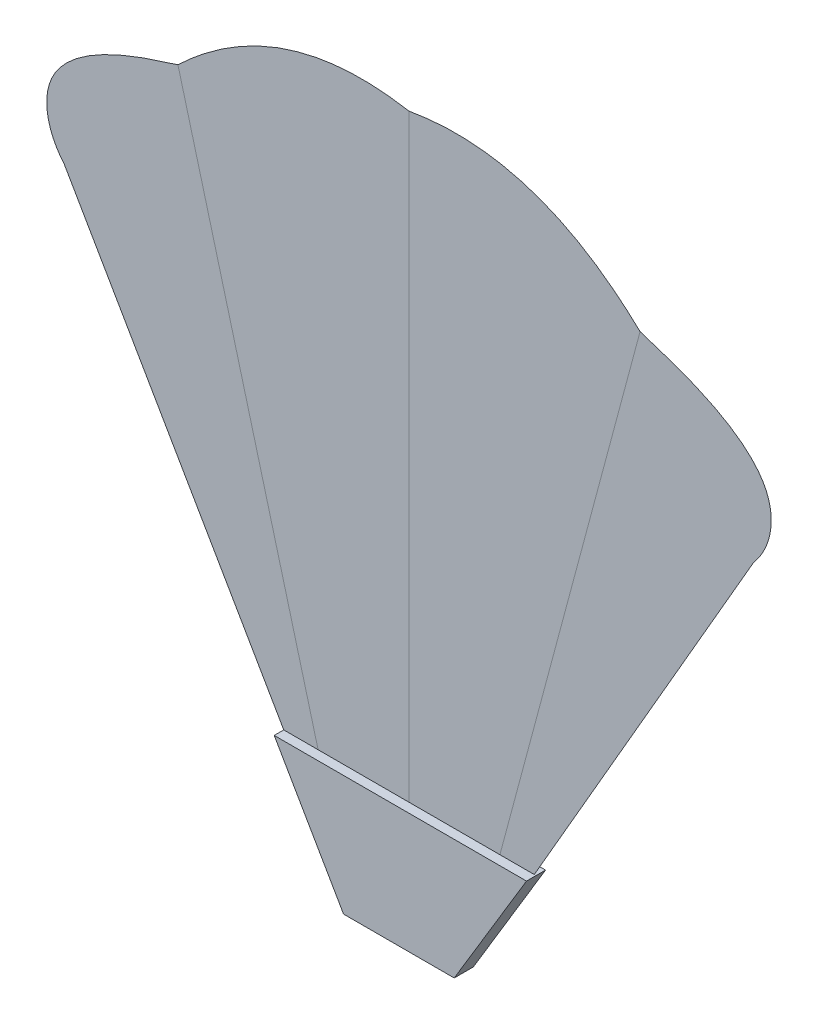
ISO-10303-21;
HEADER;
FILE_DESCRIPTION(('STEP AP214'),'2;1');
FILE_NAME('part.step','',(''),(''),'','','');
FILE_SCHEMA(('AUTOMOTIVE_DESIGN { 1 0 10303 214 1 1 1 1 }'));
ENDSEC;
DATA;
#1=APPLICATION_CONTEXT('core data for automotive mechanical design processes');
#2=APPLICATION_PROTOCOL_DEFINITION('international standard','automotive_design',2000,#1);
#3=PRODUCT_CONTEXT('',#1,'mechanical');
#4=PRODUCT('Part','Part','',(#3));
#5=PRODUCT_RELATED_PRODUCT_CATEGORY('part','',(#4));
#6=PRODUCT_DEFINITION_FORMATION('','',#4);
#7=PRODUCT_DEFINITION_CONTEXT('part definition',#1,'design');
#8=PRODUCT_DEFINITION('design','',#6,#7);
#9=PRODUCT_DEFINITION_SHAPE('','',#8);
#10=(LENGTH_UNIT() NAMED_UNIT(*) SI_UNIT(.MILLI.,.METRE.));
#11=(NAMED_UNIT(*) PLANE_ANGLE_UNIT() SI_UNIT($,.RADIAN.));
#12=(NAMED_UNIT(*) SI_UNIT($,.STERADIAN.) SOLID_ANGLE_UNIT());
#13=UNCERTAINTY_MEASURE_WITH_UNIT(LENGTH_MEASURE(1.E-05),#10,'distance_accuracy_value','');
#14=(GEOMETRIC_REPRESENTATION_CONTEXT(3) GLOBAL_UNCERTAINTY_ASSIGNED_CONTEXT((#13)) GLOBAL_UNIT_ASSIGNED_CONTEXT((#10,
#11,#12)) REPRESENTATION_CONTEXT('',''));
#15=CARTESIAN_POINT('',(0.,0.,0.));
#16=DIRECTION('',(0.,0.,1.));
#17=DIRECTION('',(1.,0.,0.));
#18=AXIS2_PLACEMENT_3D('',#15,#16,#17);
#19=CARTESIAN_POINT('',(-52.5710317573309,-370.671309457904,4.));
#20=DIRECTION('',(0.866025403784439,0.5,0.));
#21=DIRECTION('',(-0.5,0.866025403784439,0.));
#22=AXIS2_PLACEMENT_3D('',#19,#20,#21);
#23=PLANE('',#22);
#24=DIRECTION('',(0.5,-0.866025403784439,0.));
#25=VECTOR('',#24,1.);
#26=CARTESIAN_POINT('',(-52.5710317573309,-370.671309457904,-4.));
#27=LINE('',#26,#25);
#28=CARTESIAN_POINT('',(-52.5710317573309,-370.671309457904,-4.));
#29=VERTEX_POINT('',#28);
#30=CARTESIAN_POINT('',(-23.4712554232924,-421.073600557349,-4.));
#31=VERTEX_POINT('',#30);
#32=EDGE_CURVE('E154',#29,#31,#27,.T.);
#33=ORIENTED_EDGE('',*,*,#32,.T.);
#34=DIRECTION('',(0.,0.,-1.));
#35=VECTOR('',#34,1.);
#36=CARTESIAN_POINT('',(-23.4712554232924,-421.073600557349,4.));
#37=LINE('',#36,#35);
#38=CARTESIAN_POINT('',(-23.4712554232924,-421.073600557349,4.));
#39=VERTEX_POINT('',#38);
#40=EDGE_CURVE('E14',#39,#31,#37,.T.);
#41=ORIENTED_EDGE('',*,*,#40,.F.);
#42=DIRECTION('',(0.5,-0.866025403784439,0.));
#43=VECTOR('',#42,1.);
#44=CARTESIAN_POINT('',(-52.5710317573309,-370.671309457904,4.));
#45=LINE('',#44,#43);
#46=CARTESIAN_POINT('',(-52.5710317573309,-370.671309457904,4.));
#47=VERTEX_POINT('',#46);
#48=EDGE_CURVE('E142',#47,#39,#45,.T.);
#49=ORIENTED_EDGE('',*,*,#48,.F.);
#50=DIRECTION('',(0.,0.,-1.));
#51=VECTOR('',#50,1.);
#52=CARTESIAN_POINT('',(-52.5710317573309,-370.671309457904,4.));
#53=LINE('',#52,#51);
#54=EDGE_CURVE('E150',#47,#29,#53,.T.);
#55=ORIENTED_EDGE('',*,*,#54,.T.);
#56=EDGE_LOOP('',(#33,#41,#49,#55));
#57=FACE_BOUND('',#56,.T.);
#58=ADVANCED_FACE('F91',(#57),#23,.F.);
#59=CARTESIAN_POINT('',(-23.4712554232924,-421.073600557349,4.));
#60=DIRECTION('',(0.,1.,0.));
#61=DIRECTION('',(0.,0.,1.));
#62=AXIS2_PLACEMENT_3D('',#59,#60,#61);
#63=PLANE('',#62);
#64=CARTESIAN_POINT('',(0.,-421.073600557349,0.));
#65=DIRECTION('',(0.,-1.,0.));
#66=DIRECTION('',(0.,0.,-1.));
#67=AXIS2_PLACEMENT_3D('',#64,#65,#66);
#68=CIRCLE('',#67,1.75);
#69=CARTESIAN_POINT('',(0.,-421.073600557349,-1.75));
#70=VERTEX_POINT('',#69);
#71=EDGE_CURVE('E168',#70,#70,#68,.T.);
#72=ORIENTED_EDGE('',*,*,#71,.F.);
#73=EDGE_LOOP('',(#72));
#74=FACE_BOUND('',#73,.T.);
#75=DIRECTION('',(1.,0.,0.));
#76=VECTOR('',#75,1.);
#77=CARTESIAN_POINT('',(-23.4712554232924,-421.073600557349,-4.));
#78=LINE('',#77,#76);
#79=CARTESIAN_POINT('',(22.9815003626385,-421.073600557349,-4.));
#80=VERTEX_POINT('',#79);
#81=EDGE_CURVE('E146',#31,#80,#78,.T.);
#82=ORIENTED_EDGE('',*,*,#81,.T.);
#83=DIRECTION('',(0.,0.,-1.));
#84=VECTOR('',#83,1.);
#85=CARTESIAN_POINT('',(22.9815003626385,-421.073600557349,4.));
#86=LINE('',#85,#84);
#87=CARTESIAN_POINT('',(22.9815003626385,-421.073600557349,4.));
#88=VERTEX_POINT('',#87);
#89=EDGE_CURVE('E99',#88,#80,#86,.T.);
#90=ORIENTED_EDGE('',*,*,#89,.F.);
#91=DIRECTION('',(1.,0.,0.));
#92=VECTOR('',#91,1.);
#93=CARTESIAN_POINT('',(-23.4712554232924,-421.073600557349,4.));
#94=LINE('',#93,#92);
#95=EDGE_CURVE('E137',#39,#88,#94,.T.);
#96=ORIENTED_EDGE('',*,*,#95,.F.);
#97=ORIENTED_EDGE('',*,*,#40,.T.);
#98=EDGE_LOOP('',(#82,#90,#96,#97));
#99=FACE_BOUND('',#98,.T.);
#100=ADVANCED_FACE('F145',(#74,#99),#63,.F.);
#101=CARTESIAN_POINT('',(22.9815003626385,-421.073600557349,4.));
#102=DIRECTION('',(-0.856782690973709,0.515677632293519,0.));
#103=DIRECTION('',(-0.515677632293519,-0.856782690973709,0.));
#104=AXIS2_PLACEMENT_3D('',#101,#102,#103);
#105=PLANE('',#104);
#106=DIRECTION('',(0.515677632293519,0.856782690973709,0.));
#107=VECTOR('',#106,1.);
#108=CARTESIAN_POINT('',(22.9815003626385,-421.073600557349,-4.));
#109=LINE('',#108,#107);
#110=CARTESIAN_POINT('',(53.3174705102055,-370.671309457904,-4.));
#111=VERTEX_POINT('',#110);
#112=EDGE_CURVE('E124',#80,#111,#109,.T.);
#113=ORIENTED_EDGE('',*,*,#112,.T.);
#114=DIRECTION('',(0.,0.,-1.));
#115=VECTOR('',#114,1.);
#116=CARTESIAN_POINT('',(53.3174705102055,-370.671309457904,4.));
#117=LINE('',#116,#115);
#118=CARTESIAN_POINT('',(53.3174705102055,-370.671309457904,4.));
#119=VERTEX_POINT('',#118);
#120=EDGE_CURVE('E147',#119,#111,#117,.T.);
#121=ORIENTED_EDGE('',*,*,#120,.F.);
#122=DIRECTION('',(0.515677632293519,0.856782690973709,0.));
#123=VECTOR('',#122,1.);
#124=CARTESIAN_POINT('',(22.9815003626385,-421.073600557349,4.));
#125=LINE('',#124,#123);
#126=EDGE_CURVE('E140',#88,#119,#125,.T.);
#127=ORIENTED_EDGE('',*,*,#126,.F.);
#128=ORIENTED_EDGE('',*,*,#89,.T.);
#129=EDGE_LOOP('',(#113,#121,#127,#128));
#130=FACE_BOUND('',#129,.T.);
#131=ADVANCED_FACE('F148',(#130),#105,.F.);
#132=CARTESIAN_POINT('',(-52.5710317573309,-370.671309457904,4.));
#133=DIRECTION('',(0.,-1.,0.));
#134=DIRECTION('',(0.,0.,-1.));
#135=AXIS2_PLACEMENT_3D('',#132,#133,#134);
#136=PLANE('',#135);
#137=DIRECTION('',(-1.,0.,0.));
#138=VECTOR('',#137,1.);
#139=CARTESIAN_POINT('',(-52.5710317573309,-370.671309457904,-4.));
#140=LINE('',#139,#138);
#141=EDGE_CURVE('E130',#111,#29,#140,.T.);
#142=ORIENTED_EDGE('',*,*,#141,.T.);
#143=ORIENTED_EDGE('',*,*,#54,.F.);
#144=DIRECTION('',(-1.,0.,0.));
#145=VECTOR('',#144,1.);
#146=CARTESIAN_POINT('',(-52.5710317573309,-370.671309457904,4.));
#147=LINE('',#146,#145);
#148=EDGE_CURVE('E107',#119,#47,#147,.T.);
#149=ORIENTED_EDGE('',*,*,#148,.F.);
#150=ORIENTED_EDGE('',*,*,#120,.T.);
#151=EDGE_LOOP('',(#142,#143,#149,#150));
#152=FACE_BOUND('',#151,.T.);
#153=ADVANCED_FACE('F162',(#152),#136,.F.);
#154=CARTESIAN_POINT('',(0.,0.,4.));
#155=DIRECTION('',(0.,0.,1.));
#156=DIRECTION('',(1.,0.,0.));
#157=AXIS2_PLACEMENT_3D('',#154,#155,#156);
#158=PLANE('',#157);
#159=ORIENTED_EDGE('',*,*,#48,.T.);
#160=ORIENTED_EDGE('',*,*,#95,.T.);
#161=ORIENTED_EDGE('',*,*,#126,.T.);
#162=ORIENTED_EDGE('',*,*,#148,.T.);
#163=EDGE_LOOP('',(#159,#160,#161,#162));
#164=FACE_BOUND('',#163,.T.);
#165=ADVANCED_FACE('F138',(#164),#158,.T.);
#166=CARTESIAN_POINT('',(0.,0.,-4.));
#167=DIRECTION('',(0.,0.,1.));
#168=DIRECTION('',(1.,0.,0.));
#169=AXIS2_PLACEMENT_3D('',#166,#167,#168);
#170=PLANE('',#169);
#171=ORIENTED_EDGE('',*,*,#32,.F.);
#172=ORIENTED_EDGE('',*,*,#141,.F.);
#173=ORIENTED_EDGE('',*,*,#112,.F.);
#174=ORIENTED_EDGE('',*,*,#81,.F.);
#175=EDGE_LOOP('',(#171,#172,#173,#174));
#176=FACE_BOUND('',#175,.T.);
#177=ADVANCED_FACE('F165',(#176),#170,.F.);
#178=CARTESIAN_POINT('',(0.,-416.073600557349,0.));
#179=DIRECTION('',(0.,-1.,0.));
#180=DIRECTION('',(0.,0.,-1.));
#181=AXIS2_PLACEMENT_3D('',#178,#179,#180);
#182=CYLINDRICAL_SURFACE('',#181,1.75);
#183=CARTESIAN_POINT('',(0.,-416.073600557349,0.));
#184=DIRECTION('',(0.,-1.,0.));
#185=DIRECTION('',(0.,0.,-1.));
#186=AXIS2_PLACEMENT_3D('',#183,#184,#185);
#187=CIRCLE('',#186,1.75);
#188=CARTESIAN_POINT('',(0.,-416.073600557349,-1.75));
#189=VERTEX_POINT('',#188);
#190=EDGE_CURVE('E157',#189,#189,#187,.T.);
#191=ORIENTED_EDGE('',*,*,#190,.F.);
#192=EDGE_LOOP('',(#191));
#193=FACE_BOUND('',#192,.T.);
#194=ORIENTED_EDGE('',*,*,#71,.T.);
#195=EDGE_LOOP('',(#194));
#196=FACE_BOUND('',#195,.T.);
#197=ADVANCED_FACE('F176',(#193,#196),#182,.F.);
#198=CARTESIAN_POINT('',(0.,-416.073600557349,0.));
#199=DIRECTION('',(0.,-1.,0.));
#200=DIRECTION('',(0.,0.,-1.));
#201=AXIS2_PLACEMENT_3D('',#198,#199,#200);
#202=PLANE('',#201);
#203=ORIENTED_EDGE('',*,*,#190,.T.);
#204=EDGE_LOOP('',(#203));
#205=FACE_BOUND('',#204,.T.);
#206=ADVANCED_FACE('F174',(#205),#202,.T.);
#207=CLOSED_SHELL('',(#58,#100,#131,#153,#165,#177,#197,#206));
#208=MANIFOLD_SOLID_BREP('B2',#207);
#209=CARTESIAN_POINT('',(0.,0.,0.));
#210=DIRECTION('',(0.,0.,1.));
#211=DIRECTION('',(-1.,0.,0.));
#212=AXIS2_PLACEMENT_3D('',#209,#210,#211);
#213=PLANE('',#212);
#214=CARTESIAN_POINT('',(0.,-119.453282977764,0.));
#215=CARTESIAN_POINT('',(53.8199687706438,-109.90409605022,0.));
#216=CARTESIAN_POINT('',(96.9872981077789,-151.105229203007,0.));
#217=B_SPLINE_CURVE_WITH_KNOTS('',2,(#214,#215,#216),.UNSPECIFIED.,.F.,.F.,(3,3),(0.,1.),.UNSPECIFIED.);
#218=CARTESIAN_POINT('',(0.,-119.453282977764,0.));
#219=VERTEX_POINT('',#218);
#220=CARTESIAN_POINT('',(96.9872981077789,-151.105229203007,0.));
#221=VERTEX_POINT('',#220);
#222=EDGE_CURVE('E275',#219,#221,#217,.T.);
#223=ORIENTED_EDGE('',*,*,#222,.F.);
#224=DIRECTION('',(0.,1.,0.));
#225=VECTOR('',#224,1.);
#226=CARTESIAN_POINT('',(0.,-119.453282977764,0.));
#227=LINE('',#226,#225);
#228=CARTESIAN_POINT('',(0.,-401.105229203007,0.));
#229=VERTEX_POINT('',#228);
#230=EDGE_CURVE('E89',#229,#219,#227,.T.);
#231=ORIENTED_EDGE('',*,*,#230,.F.);
#232=DIRECTION('',(-1.,0.,0.));
#233=VECTOR('',#232,1.);
#234=CARTESIAN_POINT('',(0.,-401.105229203007,0.));
#235=LINE('',#234,#233);
#236=CARTESIAN_POINT('',(30.,-401.105229203007,0.));
#237=VERTEX_POINT('',#236);
#238=EDGE_CURVE('E260',#237,#229,#235,.T.);
#239=ORIENTED_EDGE('',*,*,#238,.F.);
#240=DIRECTION('',(-0.258819045102514,-0.96592582628907,0.));
#241=VECTOR('',#240,1.);
#242=CARTESIAN_POINT('',(30.,-401.105229203007,0.));
#243=LINE('',#242,#241);
#244=EDGE_CURVE('E273',#221,#237,#243,.T.);
#245=ORIENTED_EDGE('',*,*,#244,.F.);
#246=EDGE_LOOP('',(#223,#231,#239,#245));
#247=FACE_BOUND('',#246,.T.);
#248=ADVANCED_FACE('F254',(#247),#213,.T.);
#249=OPEN_SHELL('',(#248));
#250=SHELL_BASED_SURFACE_MODEL('B8',(#249));
#251=CARTESIAN_POINT('',(30.,-401.105229203007,0.));
#252=DIRECTION('',(0.,0.,1.));
#253=DIRECTION('',(0.258819045102515,0.96592582628907,0.));
#254=AXIS2_PLACEMENT_3D('',#251,#252,#253);
#255=PLANE('',#254);
#256=DIRECTION('',(0.258819045102514,0.96592582628907,0.));
#257=VECTOR('',#256,1.);
#258=CARTESIAN_POINT('',(63.4936490538894,-276.105229203007,0.));
#259=LINE('',#258,#257);
#260=CARTESIAN_POINT('',(30.,-401.105229203007,0.));
#261=VERTEX_POINT('',#260);
#262=CARTESIAN_POINT('',(96.9872981077789,-151.105229203007,0.));
#263=VERTEX_POINT('',#262);
#264=EDGE_CURVE('E252',#261,#263,#259,.T.);
#265=ORIENTED_EDGE('',*,*,#264,.F.);
#266=DIRECTION('',(-1.,0.,0.));
#267=VECTOR('',#266,1.);
#268=CARTESIAN_POINT('',(32.5,-401.105229203007,0.));
#269=LINE('',#268,#267);
#270=CARTESIAN_POINT('',(35.,-401.105229203007,0.));
#271=VERTEX_POINT('',#270);
#272=EDGE_CURVE('E322',#271,#261,#269,.T.);
#273=ORIENTED_EDGE('',*,*,#272,.F.);
#274=DIRECTION('',(-0.500000000000002,-0.866025403784438,0.));
#275=VECTOR('',#274,1.);
#276=CARTESIAN_POINT('',(89.8482755730146,-306.105229203007,0.));
#277=LINE('',#276,#275);
#278=CARTESIAN_POINT('',(144.696551146029,-211.105229203007,0.));
#279=VERTEX_POINT('',#278);
#280=EDGE_CURVE('E333',#279,#271,#277,.T.);
#281=ORIENTED_EDGE('',*,*,#280,.F.);
#282=CARTESIAN_POINT('',(96.9872981077789,-151.105229203007,0.));
#283=CARTESIAN_POINT('',(111.903367358748,-155.80447653079,0.));
#284=CARTESIAN_POINT('',(158.471392544391,-169.561010987661,0.));
#285=CARTESIAN_POINT('',(151.503506484088,-203.193208576239,0.));
#286=CARTESIAN_POINT('',(144.696551146029,-211.105229203007,0.));
#287=B_SPLINE_CURVE_WITH_KNOTS('',3,(#282,#283,#284,#285,#286),.UNSPECIFIED.,.F.,.F.,(4,1,4),
(0.,0.703620149940636,1.),.UNSPECIFIED.);
#288=EDGE_CURVE('E328',#263,#279,#287,.T.);
#289=ORIENTED_EDGE('',*,*,#288,.F.);
#290=EDGE_LOOP('',(#265,#273,#281,#289));
#291=FACE_BOUND('',#290,.T.);
#292=ADVANCED_FACE('F321',(#291),#255,.T.);
#293=OPEN_SHELL('',(#292));
#294=SHELL_BASED_SURFACE_MODEL('B83',(#293));
#295=CARTESIAN_POINT('',(-30.,-401.105229203007,0.));
#296=DIRECTION('',(0.,0.,1.));
#297=DIRECTION('',(-0.258819045102515,0.96592582628907,0.));
#298=AXIS2_PLACEMENT_3D('',#295,#296,#297);
#299=PLANE('',#298);
#300=DIRECTION('',(-0.258819045102514,0.96592582628907,0.));
#301=VECTOR('',#300,1.);
#302=CARTESIAN_POINT('',(-63.4936490538894,-276.105229203007,0.));
#303=LINE('',#302,#301);
#304=CARTESIAN_POINT('',(-30.,-401.105229203007,0.));
#305=VERTEX_POINT('',#304);
#306=CARTESIAN_POINT('',(-96.9872981077789,-151.105229203007,0.));
#307=VERTEX_POINT('',#306);
#308=EDGE_CURVE('E319',#305,#307,#303,.T.);
#309=ORIENTED_EDGE('',*,*,#308,.T.);
#310=CARTESIAN_POINT('',(-96.9872981077789,-151.105229203007,0.));
#311=CARTESIAN_POINT('',(-111.903367358748,-155.80447653079,0.));
#312=CARTESIAN_POINT('',(-158.471392544391,-169.561010987661,0.));
#313=CARTESIAN_POINT('',(-151.503506484088,-203.193208576239,0.));
#314=CARTESIAN_POINT('',(-144.696551146029,-211.105229203007,0.));
#315=B_SPLINE_CURVE_WITH_KNOTS('',3,(#310,#311,#312,#313,#314),.UNSPECIFIED.,.F.,.F.,(4,1,4),
(0.,0.703620149940636,1.),.UNSPECIFIED.);
#316=CARTESIAN_POINT('',(-144.696551146029,-211.105229203007,0.));
#317=VERTEX_POINT('',#316);
#318=EDGE_CURVE('E386',#307,#317,#315,.T.);
#319=ORIENTED_EDGE('',*,*,#318,.T.);
#320=DIRECTION('',(0.500000000000002,-0.866025403784438,0.));
#321=VECTOR('',#320,1.);
#322=CARTESIAN_POINT('',(-89.8482755730146,-306.105229203007,0.));
#323=LINE('',#322,#321);
#324=CARTESIAN_POINT('',(-35.,-401.105229203007,0.));
#325=VERTEX_POINT('',#324);
#326=EDGE_CURVE('E394',#317,#325,#323,.T.);
#327=ORIENTED_EDGE('',*,*,#326,.T.);
#328=DIRECTION('',(1.,0.,0.));
#329=VECTOR('',#328,1.);
#330=CARTESIAN_POINT('',(-32.5,-401.105229203007,0.));
#331=LINE('',#330,#329);
#332=EDGE_CURVE('E380',#325,#305,#331,.T.);
#333=ORIENTED_EDGE('',*,*,#332,.T.);
#334=EDGE_LOOP('',(#309,#319,#327,#333));
#335=FACE_BOUND('',#334,.T.);
#336=ADVANCED_FACE('F379',(#335),#299,.T.);
#337=OPEN_SHELL('',(#336));
#338=SHELL_BASED_SURFACE_MODEL('B246',(#337));
#339=CARTESIAN_POINT('',(0.,0.,0.));
#340=DIRECTION('',(0.,0.,1.));
#341=DIRECTION('',(1.,0.,0.));
#342=AXIS2_PLACEMENT_3D('',#339,#340,#341);
#343=PLANE('',#342);
#344=CARTESIAN_POINT('',(0.,-119.453282977764,0.));
#345=CARTESIAN_POINT('',(-53.8199687706438,-109.90409605022,0.));
#346=CARTESIAN_POINT('',(-96.9872981077789,-151.105229203007,0.));
#347=B_SPLINE_CURVE_WITH_KNOTS('',2,(#344,#345,#346),.UNSPECIFIED.,.F.,.F.,(3,3),(0.,1.),.UNSPECIFIED.);
#348=CARTESIAN_POINT('',(0.,-119.453282977764,0.));
#349=VERTEX_POINT('',#348);
#350=CARTESIAN_POINT('',(-96.9872981077789,-151.105229203007,0.));
#351=VERTEX_POINT('',#350);
#352=EDGE_CURVE('E437',#349,#351,#347,.T.);
#353=ORIENTED_EDGE('',*,*,#352,.T.);
#354=DIRECTION('',(0.258819045102514,-0.96592582628907,0.));
#355=VECTOR('',#354,1.);
#356=CARTESIAN_POINT('',(-30.,-401.105229203007,0.));
#357=LINE('',#356,#355);
#358=CARTESIAN_POINT('',(-30.,-401.105229203007,0.));
#359=VERTEX_POINT('',#358);
#360=EDGE_CURVE('E448',#351,#359,#357,.T.);
#361=ORIENTED_EDGE('',*,*,#360,.T.);
#362=DIRECTION('',(1.,0.,0.));
#363=VECTOR('',#362,1.);
#364=CARTESIAN_POINT('',(0.,-401.105229203007,0.));
#365=LINE('',#364,#363);
#366=CARTESIAN_POINT('',(0.,-401.105229203007,0.));
#367=VERTEX_POINT('',#366);
#368=EDGE_CURVE('E433',#359,#367,#365,.T.);
#369=ORIENTED_EDGE('',*,*,#368,.T.);
#370=DIRECTION('',(0.,1.,0.));
#371=VECTOR('',#370,1.);
#372=CARTESIAN_POINT('',(0.,-119.453282977764,0.));
#373=LINE('',#372,#371);
#374=EDGE_CURVE('E377',#367,#349,#373,.T.);
#375=ORIENTED_EDGE('',*,*,#374,.T.);
#376=EDGE_LOOP('',(#353,#361,#369,#375));
#377=FACE_BOUND('',#376,.T.);
#378=ADVANCED_FACE('F427',(#377),#343,.T.);
#379=OPEN_SHELL('',(#378));
#380=SHELL_BASED_SURFACE_MODEL('B313',(#379));
#381=ADVANCED_BREP_SHAPE_REPRESENTATION('',(#18,#208),#14);
#382=MANIFOLD_SURFACE_SHAPE_REPRESENTATION('',(#18,#250,#294,#338,#380),#14);
#383=SHAPE_REPRESENTATION('',(#18),#14);
#384=SHAPE_DEFINITION_REPRESENTATION(#9,#383);
#385=SHAPE_REPRESENTATION_RELATIONSHIP('','',#383,#381);
#386=SHAPE_REPRESENTATION_RELATIONSHIP('','',#383,#382);
ENDSEC;
END-ISO-10303-21;
